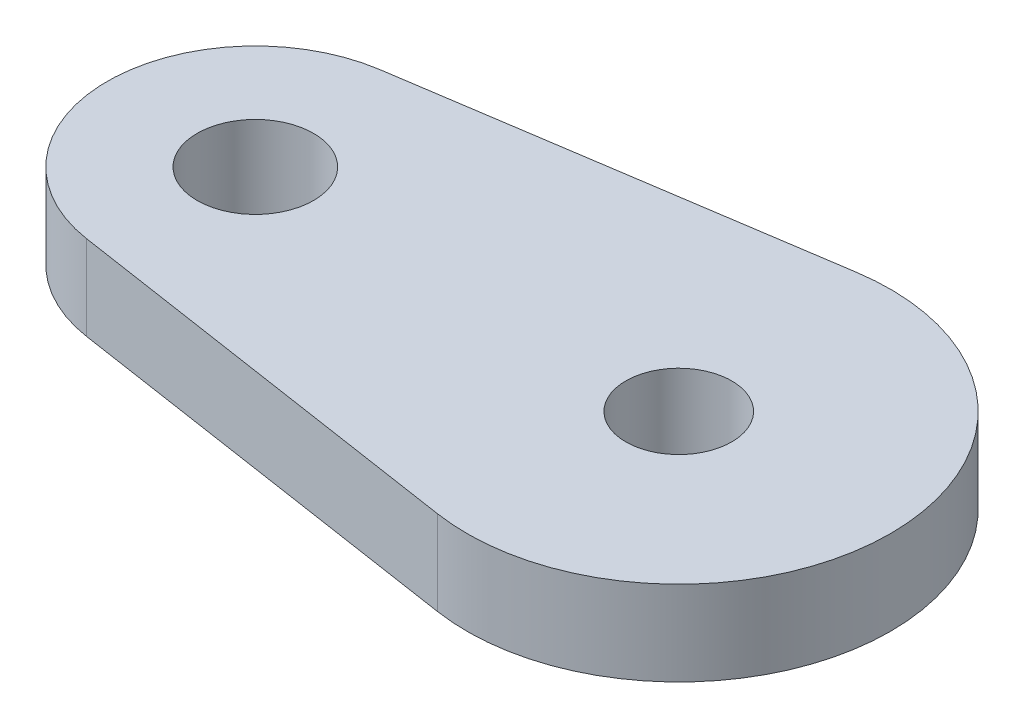
ISO-10303-21;
HEADER;
FILE_DESCRIPTION(('STEP AP214'),'2;1');
FILE_NAME('part.step','',(''),(''),'','','');
FILE_SCHEMA(('AUTOMOTIVE_DESIGN { 1 0 10303 214 1 1 1 1 }'));
ENDSEC;
DATA;
#1=APPLICATION_CONTEXT('core data for automotive mechanical design processes');
#2=APPLICATION_PROTOCOL_DEFINITION('international standard','automotive_design',2000,#1);
#3=PRODUCT_CONTEXT('',#1,'mechanical');
#4=PRODUCT('Part','Part','',(#3));
#5=PRODUCT_RELATED_PRODUCT_CATEGORY('part','',(#4));
#6=PRODUCT_DEFINITION_FORMATION('','',#4);
#7=PRODUCT_DEFINITION_CONTEXT('part definition',#1,'design');
#8=PRODUCT_DEFINITION('design','',#6,#7);
#9=PRODUCT_DEFINITION_SHAPE('','',#8);
#10=(LENGTH_UNIT() NAMED_UNIT(*) SI_UNIT(.MILLI.,.METRE.));
#11=(NAMED_UNIT(*) PLANE_ANGLE_UNIT() SI_UNIT($,.RADIAN.));
#12=(NAMED_UNIT(*) SI_UNIT($,.STERADIAN.) SOLID_ANGLE_UNIT());
#13=UNCERTAINTY_MEASURE_WITH_UNIT(LENGTH_MEASURE(1.E-05),#10,'distance_accuracy_value','');
#14=(GEOMETRIC_REPRESENTATION_CONTEXT(3) GLOBAL_UNCERTAINTY_ASSIGNED_CONTEXT((#13)) GLOBAL_UNIT_ASSIGNED_CONTEXT((#10,
#11,#12)) REPRESENTATION_CONTEXT('',''));
#15=CARTESIAN_POINT('',(0.,0.,0.));
#16=DIRECTION('',(0.,0.,1.));
#17=DIRECTION('',(1.,0.,0.));
#18=AXIS2_PLACEMENT_3D('',#15,#16,#17);
#19=CARTESIAN_POINT('',(-1.05,4.,-6.92080197664982));
#20=DIRECTION('',(0.15,0.,0.988685996664259));
#21=DIRECTION('',(0.98868599666426,0.,-0.15));
#22=AXIS2_PLACEMENT_3D('',#19,#20,#21);
#23=PLANE('',#22);
#24=DIRECTION('',(-0.98868599666426,0.,0.15));
#25=VECTOR('',#24,1.);
#26=CARTESIAN_POINT('',(-1.05,0.,-6.92080197664982));
#27=LINE('',#26,#25);
#28=CARTESIAN_POINT('',(18.5,0.,-9.88685996664259));
#29=VERTEX_POINT('',#28);
#30=CARTESIAN_POINT('',(-1.05,0.,-6.92080197664982));
#31=VERTEX_POINT('',#30);
#32=EDGE_CURVE('E105',#29,#31,#27,.T.);
#33=ORIENTED_EDGE('',*,*,#32,.T.);
#34=DIRECTION('',(0.,-1.,0.));
#35=VECTOR('',#34,1.);
#36=CARTESIAN_POINT('',(-1.05,4.,-6.92080197664982));
#37=LINE('',#36,#35);
#38=CARTESIAN_POINT('',(-1.05,4.,-6.92080197664982));
#39=VERTEX_POINT('',#38);
#40=EDGE_CURVE('E11',#39,#31,#37,.T.);
#41=ORIENTED_EDGE('',*,*,#40,.F.);
#42=DIRECTION('',(-0.98868599666426,0.,0.15));
#43=VECTOR('',#42,1.);
#44=CARTESIAN_POINT('',(-1.05,4.,-6.92080197664982));
#45=LINE('',#44,#43);
#46=CARTESIAN_POINT('',(18.5,4.,-9.88685996664259));
#47=VERTEX_POINT('',#46);
#48=EDGE_CURVE('E87',#47,#39,#45,.T.);
#49=ORIENTED_EDGE('',*,*,#48,.F.);
#50=DIRECTION('',(0.,-1.,0.));
#51=VECTOR('',#50,1.);
#52=CARTESIAN_POINT('',(18.5,4.,-9.88685996664259));
#53=LINE('',#52,#51);
#54=EDGE_CURVE('E104',#47,#29,#53,.T.);
#55=ORIENTED_EDGE('',*,*,#54,.T.);
#56=EDGE_LOOP('',(#33,#41,#49,#55));
#57=FACE_BOUND('',#56,.T.);
#58=ADVANCED_FACE('F35',(#57),#23,.F.);
#59=CARTESIAN_POINT('',(0.,4.,0.));
#60=DIRECTION('',(0.,-1.,0.));
#61=DIRECTION('',(0.,0.,-1.));
#62=AXIS2_PLACEMENT_3D('',#59,#60,#61);
#63=CYLINDRICAL_SURFACE('',#62,7.);
#64=CARTESIAN_POINT('',(0.,0.,0.));
#65=DIRECTION('',(0.,1.,0.));
#66=DIRECTION('',(0.,0.,1.));
#67=AXIS2_PLACEMENT_3D('',#64,#65,#66);
#68=CIRCLE('',#67,7.);
#69=CARTESIAN_POINT('',(-1.05,0.,6.92080197664982));
#70=VERTEX_POINT('',#69);
#71=EDGE_CURVE('E91',#31,#70,#68,.T.);
#72=ORIENTED_EDGE('',*,*,#71,.T.);
#73=DIRECTION('',(0.,-1.,0.));
#74=VECTOR('',#73,1.);
#75=CARTESIAN_POINT('',(-1.05,4.,6.92080197664982));
#76=LINE('',#75,#74);
#77=CARTESIAN_POINT('',(-1.05,4.,6.92080197664982));
#78=VERTEX_POINT('',#77);
#79=EDGE_CURVE('E43',#78,#70,#76,.T.);
#80=ORIENTED_EDGE('',*,*,#79,.F.);
#81=CARTESIAN_POINT('',(0.,4.,0.));
#82=DIRECTION('',(0.,1.,0.));
#83=DIRECTION('',(0.,0.,1.));
#84=AXIS2_PLACEMENT_3D('',#81,#82,#83);
#85=CIRCLE('',#84,7.);
#86=EDGE_CURVE('E81',#39,#78,#85,.T.);
#87=ORIENTED_EDGE('',*,*,#86,.F.);
#88=ORIENTED_EDGE('',*,*,#40,.T.);
#89=EDGE_LOOP('',(#72,#80,#87,#88));
#90=FACE_BOUND('',#89,.T.);
#91=ADVANCED_FACE('F90',(#90),#63,.T.);
#92=CARTESIAN_POINT('',(-1.05,4.,6.92080197664981));
#93=DIRECTION('',(0.15,0.,-0.988685996664259));
#94=DIRECTION('',(-0.98868599666426,0.,-0.15));
#95=AXIS2_PLACEMENT_3D('',#92,#93,#94);
#96=PLANE('',#95);
#97=DIRECTION('',(0.988685996664259,0.,0.15));
#98=VECTOR('',#97,1.);
#99=CARTESIAN_POINT('',(-1.05,0.,6.92080197664981));
#100=LINE('',#99,#98);
#101=CARTESIAN_POINT('',(18.5,0.,9.88685996664259));
#102=VERTEX_POINT('',#101);
#103=EDGE_CURVE('E68',#70,#102,#100,.T.);
#104=ORIENTED_EDGE('',*,*,#103,.T.);
#105=DIRECTION('',(0.,-1.,0.));
#106=VECTOR('',#105,1.);
#107=CARTESIAN_POINT('',(18.5,4.,9.88685996664259));
#108=LINE('',#107,#106);
#109=CARTESIAN_POINT('',(18.5,4.,9.88685996664259));
#110=VERTEX_POINT('',#109);
#111=EDGE_CURVE('E92',#110,#102,#108,.T.);
#112=ORIENTED_EDGE('',*,*,#111,.F.);
#113=DIRECTION('',(0.988685996664259,0.,0.15));
#114=VECTOR('',#113,1.);
#115=CARTESIAN_POINT('',(-1.05,4.,6.92080197664981));
#116=LINE('',#115,#114);
#117=EDGE_CURVE('E85',#78,#110,#116,.T.);
#118=ORIENTED_EDGE('',*,*,#117,.F.);
#119=ORIENTED_EDGE('',*,*,#79,.T.);
#120=EDGE_LOOP('',(#104,#112,#118,#119));
#121=FACE_BOUND('',#120,.T.);
#122=ADVANCED_FACE('F93',(#121),#96,.F.);
#123=CARTESIAN_POINT('',(0.,4.,0.));
#124=DIRECTION('',(0.,-1.,0.));
#125=DIRECTION('',(0.,0.,-1.));
#126=AXIS2_PLACEMENT_3D('',#123,#124,#125);
#127=CYLINDRICAL_SURFACE('',#126,2.75);
#128=CARTESIAN_POINT('',(0.,4.,0.));
#129=DIRECTION('',(0.,1.,0.));
#130=DIRECTION('',(0.,0.,1.));
#131=AXIS2_PLACEMENT_3D('',#128,#129,#130);
#132=CIRCLE('',#131,2.75);
#133=CARTESIAN_POINT('',(0.,4.,2.75));
#134=VERTEX_POINT('',#133);
#135=EDGE_CURVE('E95',#134,#134,#132,.T.);
#136=ORIENTED_EDGE('',*,*,#135,.T.);
#137=EDGE_LOOP('',(#136));
#138=FACE_BOUND('',#137,.T.);
#139=CARTESIAN_POINT('',(0.,0.,0.));
#140=DIRECTION('',(0.,1.,0.));
#141=DIRECTION('',(0.,0.,1.));
#142=AXIS2_PLACEMENT_3D('',#139,#140,#141);
#143=CIRCLE('',#142,2.75);
#144=CARTESIAN_POINT('',(0.,0.,2.75));
#145=VERTEX_POINT('',#144);
#146=EDGE_CURVE('E111',#145,#145,#143,.T.);
#147=ORIENTED_EDGE('',*,*,#146,.F.);
#148=EDGE_LOOP('',(#147));
#149=FACE_BOUND('',#148,.T.);
#150=ADVANCED_FACE('F131',(#138,#149),#127,.F.);
#151=CARTESIAN_POINT('',(20.,4.,0.));
#152=DIRECTION('',(0.,-1.,0.));
#153=DIRECTION('',(0.,0.,-1.));
#154=AXIS2_PLACEMENT_3D('',#151,#152,#153);
#155=CYLINDRICAL_SURFACE('',#154,10.);
#156=CARTESIAN_POINT('',(20.,0.,0.));
#157=DIRECTION('',(0.,1.,0.));
#158=DIRECTION('',(0.,0.,1.));
#159=AXIS2_PLACEMENT_3D('',#156,#157,#158);
#160=CIRCLE('',#159,10.);
#161=EDGE_CURVE('E74',#102,#29,#160,.T.);
#162=ORIENTED_EDGE('',*,*,#161,.T.);
#163=ORIENTED_EDGE('',*,*,#54,.F.);
#164=CARTESIAN_POINT('',(20.,4.,0.));
#165=DIRECTION('',(0.,1.,0.));
#166=DIRECTION('',(0.,0.,1.));
#167=AXIS2_PLACEMENT_3D('',#164,#165,#166);
#168=CIRCLE('',#167,10.);
#169=EDGE_CURVE('E51',#110,#47,#168,.T.);
#170=ORIENTED_EDGE('',*,*,#169,.F.);
#171=ORIENTED_EDGE('',*,*,#111,.T.);
#172=EDGE_LOOP('',(#162,#163,#170,#171));
#173=FACE_BOUND('',#172,.T.);
#174=ADVANCED_FACE('F118',(#173),#155,.T.);
#175=CARTESIAN_POINT('',(20.,4.,0.));
#176=DIRECTION('',(0.,-1.,0.));
#177=DIRECTION('',(0.,0.,-1.));
#178=AXIS2_PLACEMENT_3D('',#175,#176,#177);
#179=CYLINDRICAL_SURFACE('',#178,2.5);
#180=CARTESIAN_POINT('',(20.,4.,0.));
#181=DIRECTION('',(0.,1.,0.));
#182=DIRECTION('',(0.,0.,1.));
#183=AXIS2_PLACEMENT_3D('',#180,#181,#182);
#184=CIRCLE('',#183,2.5);
#185=CARTESIAN_POINT('',(20.,4.,2.5));
#186=VERTEX_POINT('',#185);
#187=EDGE_CURVE('E101',#186,#186,#184,.T.);
#188=ORIENTED_EDGE('',*,*,#187,.T.);
#189=EDGE_LOOP('',(#188));
#190=FACE_BOUND('',#189,.T.);
#191=CARTESIAN_POINT('',(20.,0.,0.));
#192=DIRECTION('',(0.,1.,0.));
#193=DIRECTION('',(0.,0.,1.));
#194=AXIS2_PLACEMENT_3D('',#191,#192,#193);
#195=CIRCLE('',#194,2.5);
#196=CARTESIAN_POINT('',(20.,0.,2.5));
#197=VERTEX_POINT('',#196);
#198=EDGE_CURVE('E114',#197,#197,#195,.T.);
#199=ORIENTED_EDGE('',*,*,#198,.F.);
#200=EDGE_LOOP('',(#199));
#201=FACE_BOUND('',#200,.T.);
#202=ADVANCED_FACE('F136',(#190,#201),#179,.F.);
#203=CARTESIAN_POINT('',(0.,4.,0.));
#204=DIRECTION('',(0.,1.,0.));
#205=DIRECTION('',(0.,0.,1.));
#206=AXIS2_PLACEMENT_3D('',#203,#204,#205);
#207=PLANE('',#206);
#208=ORIENTED_EDGE('',*,*,#48,.T.);
#209=ORIENTED_EDGE('',*,*,#86,.T.);
#210=ORIENTED_EDGE('',*,*,#117,.T.);
#211=ORIENTED_EDGE('',*,*,#169,.T.);
#212=EDGE_LOOP('',(#208,#209,#210,#211));
#213=FACE_BOUND('',#212,.T.);
#214=ORIENTED_EDGE('',*,*,#135,.F.);
#215=EDGE_LOOP('',(#214));
#216=FACE_BOUND('',#215,.T.);
#217=ORIENTED_EDGE('',*,*,#187,.F.);
#218=EDGE_LOOP('',(#217));
#219=FACE_BOUND('',#218,.T.);
#220=ADVANCED_FACE('F82',(#213,#216,#219),#207,.T.);
#221=CARTESIAN_POINT('',(0.,0.,0.));
#222=DIRECTION('',(0.,1.,0.));
#223=DIRECTION('',(0.,0.,1.));
#224=AXIS2_PLACEMENT_3D('',#221,#222,#223);
#225=PLANE('',#224);
#226=ORIENTED_EDGE('',*,*,#32,.F.);
#227=ORIENTED_EDGE('',*,*,#161,.F.);
#228=ORIENTED_EDGE('',*,*,#103,.F.);
#229=ORIENTED_EDGE('',*,*,#71,.F.);
#230=EDGE_LOOP('',(#226,#227,#228,#229));
#231=FACE_BOUND('',#230,.T.);
#232=ORIENTED_EDGE('',*,*,#146,.T.);
#233=EDGE_LOOP('',(#232));
#234=FACE_BOUND('',#233,.T.);
#235=ORIENTED_EDGE('',*,*,#198,.T.);
#236=EDGE_LOOP('',(#235));
#237=FACE_BOUND('',#236,.T.);
#238=ADVANCED_FACE('F121',(#231,#234,#237),#225,.F.);
#239=CLOSED_SHELL('',(#58,#91,#122,#150,#174,#202,#220,#238));
#240=MANIFOLD_SOLID_BREP('B2',#239);
#241=ADVANCED_BREP_SHAPE_REPRESENTATION('',(#18,#240),#14);
#242=SHAPE_DEFINITION_REPRESENTATION(#9,#241);
ENDSEC;
END-ISO-10303-21;
